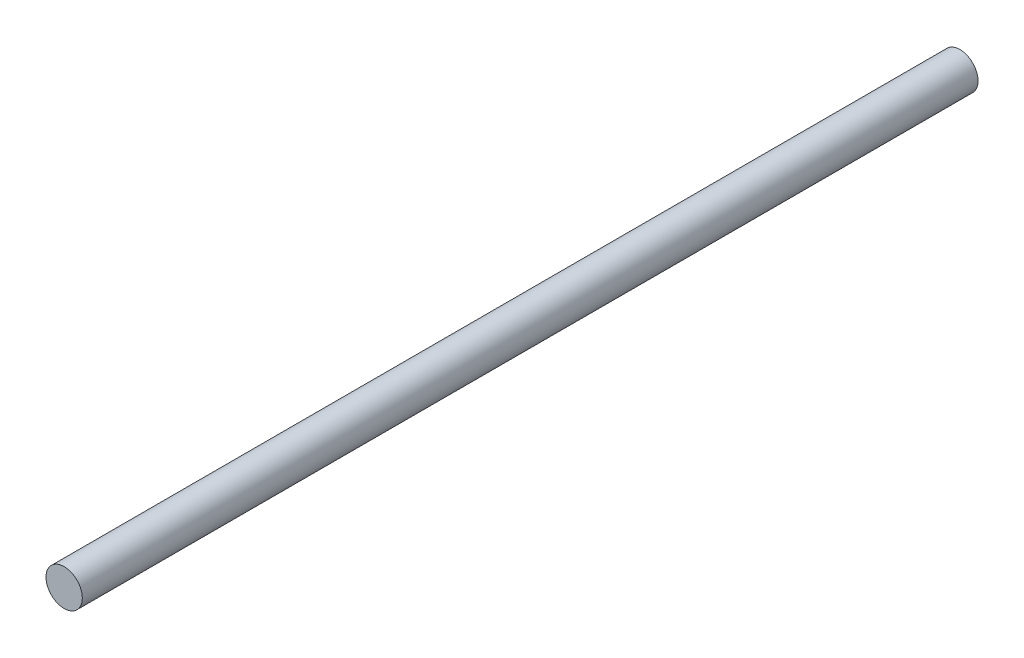
ISO-10303-21;
HEADER;
FILE_DESCRIPTION(('STEP AP214'),'2;1');
FILE_NAME('part.step','',(''),(''),'','','');
FILE_SCHEMA(('AUTOMOTIVE_DESIGN { 1 0 10303 214 1 1 1 1 }'));
ENDSEC;
DATA;
#1=APPLICATION_CONTEXT('core data for automotive mechanical design processes');
#2=APPLICATION_PROTOCOL_DEFINITION('international standard','automotive_design',2000,#1);
#3=PRODUCT_CONTEXT('',#1,'mechanical');
#4=PRODUCT('Part','Part','',(#3));
#5=PRODUCT_RELATED_PRODUCT_CATEGORY('part','',(#4));
#6=PRODUCT_DEFINITION_FORMATION('','',#4);
#7=PRODUCT_DEFINITION_CONTEXT('part definition',#1,'design');
#8=PRODUCT_DEFINITION('design','',#6,#7);
#9=PRODUCT_DEFINITION_SHAPE('','',#8);
#10=(LENGTH_UNIT() NAMED_UNIT(*) SI_UNIT(.MILLI.,.METRE.));
#11=(NAMED_UNIT(*) PLANE_ANGLE_UNIT() SI_UNIT($,.RADIAN.));
#12=(NAMED_UNIT(*) SI_UNIT($,.STERADIAN.) SOLID_ANGLE_UNIT());
#13=UNCERTAINTY_MEASURE_WITH_UNIT(LENGTH_MEASURE(1.E-05),#10,'distance_accuracy_value','');
#14=(GEOMETRIC_REPRESENTATION_CONTEXT(3) GLOBAL_UNCERTAINTY_ASSIGNED_CONTEXT((#13)) GLOBAL_UNIT_ASSIGNED_CONTEXT((#10,
#11,#12)) REPRESENTATION_CONTEXT('',''));
#15=CARTESIAN_POINT('',(0.,0.,0.));
#16=DIRECTION('',(0.,0.,1.));
#17=DIRECTION('',(1.,0.,0.));
#18=AXIS2_PLACEMENT_3D('',#15,#16,#17);
#19=CARTESIAN_POINT('',(0.,0.,218.44));
#20=DIRECTION('',(0.,0.,-1.));
#21=DIRECTION('',(-1.,0.,0.));
#22=AXIS2_PLACEMENT_3D('',#19,#20,#21);
#23=CYLINDRICAL_SURFACE('',#22,5.);
#24=CARTESIAN_POINT('',(0.,0.,218.44));
#25=DIRECTION('',(0.,0.,1.));
#26=DIRECTION('',(1.,0.,0.));
#27=AXIS2_PLACEMENT_3D('',#24,#25,#26);
#28=CIRCLE('',#27,5.);
#29=CARTESIAN_POINT('',(5.,0.,218.44));
#30=VERTEX_POINT('',#29);
#31=EDGE_CURVE('E10',#30,#30,#28,.T.);
#32=ORIENTED_EDGE('',*,*,#31,.F.);
#33=EDGE_LOOP('',(#32));
#34=FACE_BOUND('',#33,.T.);
#35=CARTESIAN_POINT('',(0.,0.,-28.36));
#36=DIRECTION('',(0.,0.,-1.));
#37=DIRECTION('',(-1.,0.,0.));
#38=AXIS2_PLACEMENT_3D('',#35,#36,#37);
#39=CIRCLE('',#38,5.);
#40=CARTESIAN_POINT('',(-5.,0.,-28.36));
#41=VERTEX_POINT('',#40);
#42=EDGE_CURVE('E44',#41,#41,#39,.T.);
#43=ORIENTED_EDGE('',*,*,#42,.F.);
#44=EDGE_LOOP('',(#43));
#45=FACE_BOUND('',#44,.T.);
#46=ADVANCED_FACE('F38',(#34,#45),#23,.T.);
#47=CARTESIAN_POINT('',(0.,0.,218.44));
#48=DIRECTION('',(0.,0.,1.));
#49=DIRECTION('',(1.,0.,0.));
#50=AXIS2_PLACEMENT_3D('',#47,#48,#49);
#51=PLANE('',#50);
#52=ORIENTED_EDGE('',*,*,#31,.T.);
#53=EDGE_LOOP('',(#52));
#54=FACE_BOUND('',#53,.T.);
#55=ADVANCED_FACE('F53',(#54),#51,.T.);
#56=CARTESIAN_POINT('',(0.,0.,-28.36));
#57=DIRECTION('',(0.,0.,-1.));
#58=DIRECTION('',(-1.,0.,0.));
#59=AXIS2_PLACEMENT_3D('',#56,#57,#58);
#60=PLANE('',#59);
#61=ORIENTED_EDGE('',*,*,#42,.T.);
#62=EDGE_LOOP('',(#61));
#63=FACE_BOUND('',#62,.T.);
#64=ADVANCED_FACE('F50',(#63),#60,.T.);
#65=CLOSED_SHELL('',(#46,#55,#64));
#66=MANIFOLD_SOLID_BREP('B2',#65);
#67=ADVANCED_BREP_SHAPE_REPRESENTATION('',(#18,#66),#14);
#68=SHAPE_DEFINITION_REPRESENTATION(#9,#67);
ENDSEC;
END-ISO-10303-21;
